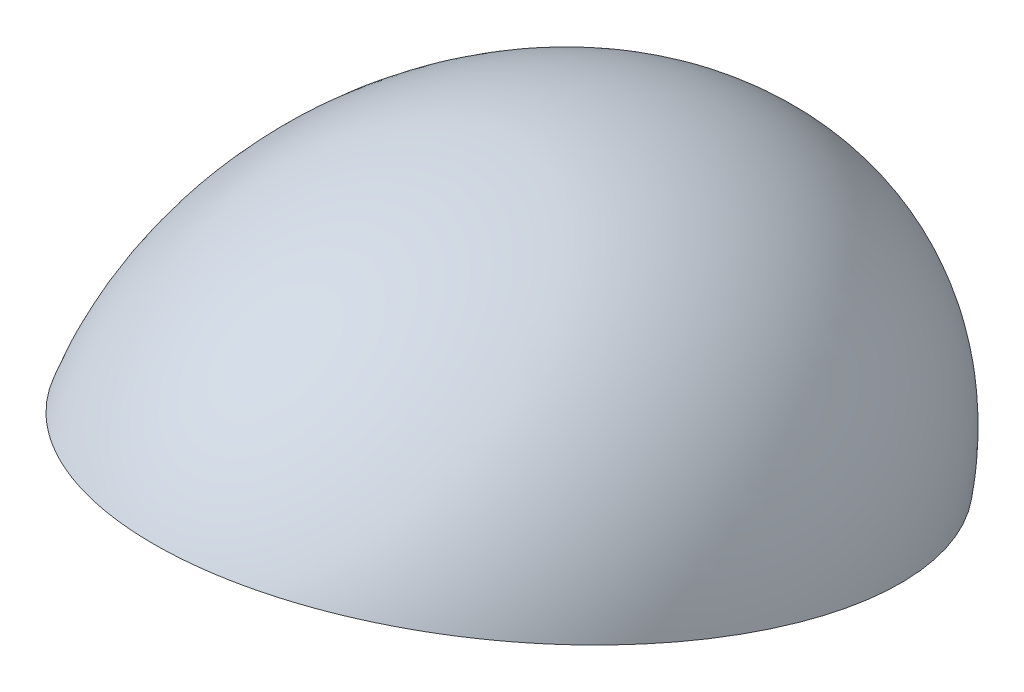
ISO-10303-21;
HEADER;
FILE_DESCRIPTION(('STEP AP214'),'2;1');
FILE_NAME('part.step','',(''),(''),'','','');
FILE_SCHEMA(('AUTOMOTIVE_DESIGN { 1 0 10303 214 1 1 1 1 }'));
ENDSEC;
DATA;
#1=APPLICATION_CONTEXT('core data for automotive mechanical design processes');
#2=APPLICATION_PROTOCOL_DEFINITION('international standard','automotive_design',2000,#1);
#3=PRODUCT_CONTEXT('',#1,'mechanical');
#4=PRODUCT('Part','Part','',(#3));
#5=PRODUCT_RELATED_PRODUCT_CATEGORY('part','',(#4));
#6=PRODUCT_DEFINITION_FORMATION('','',#4);
#7=PRODUCT_DEFINITION_CONTEXT('part definition',#1,'design');
#8=PRODUCT_DEFINITION('design','',#6,#7);
#9=PRODUCT_DEFINITION_SHAPE('','',#8);
#10=(LENGTH_UNIT() NAMED_UNIT(*) SI_UNIT(.MILLI.,.METRE.));
#11=(NAMED_UNIT(*) PLANE_ANGLE_UNIT() SI_UNIT($,.RADIAN.));
#12=(NAMED_UNIT(*) SI_UNIT($,.STERADIAN.) SOLID_ANGLE_UNIT());
#13=UNCERTAINTY_MEASURE_WITH_UNIT(LENGTH_MEASURE(1.E-05),#10,'distance_accuracy_value','');
#14=(GEOMETRIC_REPRESENTATION_CONTEXT(3) GLOBAL_UNCERTAINTY_ASSIGNED_CONTEXT((#13)) GLOBAL_UNIT_ASSIGNED_CONTEXT((#10,
#11,#12)) REPRESENTATION_CONTEXT('',''));
#15=CARTESIAN_POINT('',(0.,0.,0.));
#16=DIRECTION('',(0.,0.,1.));
#17=DIRECTION('',(1.,0.,0.));
#18=AXIS2_PLACEMENT_3D('',#15,#16,#17);
#19=CARTESIAN_POINT('',(0.,0.,0.));
#20=DIRECTION('',(0.,1.,0.));
#21=DIRECTION('',(0.,0.,1.));
#22=AXIS2_PLACEMENT_3D('',#19,#20,#21);
#23=ELLIPSE('',#22,240.,190.);
#24=TRIMMED_CURVE('',#23,(PARAMETER_VALUE(3.14159265358979)),
(PARAMETER_VALUE(6.28318530717959)),.T.,.PARAMETER.);
#25=CARTESIAN_POINT('',(0.,0.,-240.));
#26=DIRECTION('',(0.,0.,-1.));
#27=AXIS1_PLACEMENT('',#25,#26);
#28=SURFACE_OF_REVOLUTION('',#24,#27);
#29=CARTESIAN_POINT('',(0.,0.,-240.));
#30=VERTEX_POINT('',#29);
#31=VERTEX_LOOP('',#30);
#32=FACE_BOUND('',#31,.T.);
#33=CARTESIAN_POINT('',(-179.88213470112,0.,-77.2740661031294));
#34=CARTESIAN_POINT('',(-181.597068161881,1.70676053249948,-70.9043490794877));
#35=CARTESIAN_POINT('',(-183.068106610468,3.43042287389849,-64.471553646293));
#36=CARTESIAN_POINT('',(-184.91080085744,6.03285946592704,-54.7591280613656));
#37=CARTESIAN_POINT('',(-185.46447876189,6.90337601366443,-51.51031607638));
#38=CARTESIAN_POINT('',(-186.450947714877,8.6489877076251,-44.9956045442321));
#39=CARTESIAN_POINT('',(-186.883741548787,9.52408274787881,-41.7297053925535));
#40=CARTESIAN_POINT('',(-188.002755594436,12.1581478227158,-31.8992407028188));
#41=CARTESIAN_POINT('',(-188.507209374267,13.9224988308725,-25.314593097992));
#42=CARTESIAN_POINT('',(-189.033194761654,17.4559064233394,-12.1277364390553));
#43=CARTESIAN_POINT('',(-189.054728440315,19.2249629874362,-5.5255274603824));
#44=CARTESIAN_POINT('',(-188.662537054278,22.377500116953,6.23990127972219));
#45=CARTESIAN_POINT('',(-188.341744999502,23.7617974541025,11.4061692747466));
#46=CARTESIAN_POINT('',(-187.402639666538,26.5238640793082,21.7143422539053));
#47=CARTESIAN_POINT('',(-186.784283695396,27.901632401961,26.8562436351049));
#48=CARTESIAN_POINT('',(-185.248833669656,30.6461525004436,37.0989320850364));
#49=CARTESIAN_POINT('',(-184.331703448527,32.0129029220245,42.1997140996427));
#50=CARTESIAN_POINT('',(-182.197657800818,34.7299825034076,52.3399931455731));
#51=CARTESIAN_POINT('',(-180.980885673647,36.0803191898621,57.3795182667456));
#52=CARTESIAN_POINT('',(-178.245504537261,38.7602508631718,67.381159432351));
#53=CARTESIAN_POINT('',(-176.726927064428,40.0898480015114,72.3432835062327));
#54=CARTESIAN_POINT('',(-173.38604314153,42.7229483064285,82.1701476256092));
#55=CARTESIAN_POINT('',(-171.563796647528,44.0264565671711,87.0349066827863));
#56=CARTESIAN_POINT('',(-167.182949180432,46.8824746374477,97.6937112283941));
#57=CARTESIAN_POINT('',(-164.550402291502,48.4274358086109,103.459584814897));
#58=CARTESIAN_POINT('',(-158.827229623419,51.4597079034422,114.776178335181));
#59=CARTESIAN_POINT('',(-155.736627260834,52.9470217692372,120.32690924913));
#60=CARTESIAN_POINT('',(-150.758427814153,55.1241385024952,128.452019511657));
#61=CARTESIAN_POINT('',(-149.04279749478,55.8405691085526,131.125774933561));
#62=CARTESIAN_POINT('',(-145.496661699938,57.2542288888508,136.401625058251));
#63=CARTESIAN_POINT('',(-143.666152753616,57.9514574820204,139.00371759245));
#64=CARTESIAN_POINT('',(-139.890822346278,59.3247528722945,144.128925762753));
#65=CARTESIAN_POINT('',(-137.9460136171,60.000822013539,146.652050147307));
#66=CARTESIAN_POINT('',(-133.942602137556,61.329899273578,151.612234008957));
#67=CARTESIAN_POINT('',(-131.884011789373,61.9829098930822,154.049302818829));
#68=CARTESIAN_POINT('',(-127.468670404852,63.31995266783,159.039214386081));
#69=CARTESIAN_POINT('',(-125.101587945964,64.0017042201319,161.583545817411));
#70=CARTESIAN_POINT('',(-120.235592708223,65.3328220405352,166.551345154017));
#71=CARTESIAN_POINT('',(-117.736693645207,65.9821916644296,168.974825583283));
#72=CARTESIAN_POINT('',(-112.609319812475,67.2457379469962,173.690444507536));
#73=CARTESIAN_POINT('',(-109.980846356625,67.8599149623801,175.98258433379));
#74=CARTESIAN_POINT('',(-104.597863162,69.0500359465907,180.424176314018));
#75=CARTESIAN_POINT('',(-101.843361968997,69.6259825013022,182.573638118646));
#76=CARTESIAN_POINT('',(-96.2125447998159,70.736601138244,186.718523299546));
#77=CARTESIAN_POINT('',(-93.3362241566787,71.2712716369504,188.713940766026));
#78=CARTESIAN_POINT('',(-87.4673467648146,72.2961803276195,192.538952072723));
#79=CARTESIAN_POINT('',(-84.4747875039907,72.7864175585462,194.368542326303));
#80=CARTESIAN_POINT('',(-79.1235446422545,73.6055529630554,197.42559727421));
#81=CARTESIAN_POINT('',(-76.7880943497243,73.9446561552907,198.691147616641));
#82=CARTESIAN_POINT('',(-72.0583353793429,74.5942937665922,201.115628188526));
#83=CARTESIAN_POINT('',(-69.6640236119256,74.9048266819654,202.274552806121));
#84=CARTESIAN_POINT('',(-64.8208953947413,75.4959723467351,204.480738461716));
#85=CARTESIAN_POINT('',(-62.3720796922238,75.7765855060267,205.528001029465));
#86=CARTESIAN_POINT('',(-57.4244014989031,76.306658917343,207.506261932239));
#87=CARTESIAN_POINT('',(-54.9255360105271,76.5561172969381,208.437253279261));
#88=CARTESIAN_POINT('',(-49.8853052536867,77.0224785671341,210.177737234315));
#89=CARTESIAN_POINT('',(-47.3439793939437,77.2394099639149,210.987336228858));
#90=CARTESIAN_POINT('',(-42.2222316254989,77.6399202529568,212.482060976517));
#91=CARTESIAN_POINT('',(-39.6418079208129,77.8234976080158,213.167180992716));
#92=CARTESIAN_POINT('',(-34.4483703025344,78.1563280651765,214.409321169146));
#93=CARTESIAN_POINT('',(-31.8353598382604,78.3055847681595,214.966354768049));
#94=CARTESIAN_POINT('',(-26.5834993305325,78.5689851056789,215.949378210402));
#95=CARTESIAN_POINT('',(-23.9446534540812,78.683134309493,216.37538883868));
#96=CARTESIAN_POINT('',(-18.2632340295829,78.8896991857254,217.146299451839));
#97=CARTESIAN_POINT('',(-15.2176188716629,78.9765609057486,217.470471804198));
#98=CARTESIAN_POINT('',(-9.11207014033027,79.1028199843052,217.941677100288));
#99=CARTESIAN_POINT('',(-6.05213799618496,79.1422219833714,218.088727362723));
#100=CARTESIAN_POINT('',(0.0712269588664643,79.1732888517304,218.204670493871));
#101=CARTESIAN_POINT('',(3.13465961214561,79.1649557919096,218.173571091237));
#102=CARTESIAN_POINT('',(9.25313776869386,79.1006273948537,217.933494245055));
#103=CARTESIAN_POINT('',(12.3081854590956,79.0446459705515,217.724568725279));
#104=CARTESIAN_POINT('',(18.3999360173986,78.8854498169445,217.130440591648));
#105=CARTESIAN_POINT('',(21.436638223593,78.7822333940957,216.745231657401));
#106=CARTESIAN_POINT('',(27.4808205235628,78.5293192944584,215.801343387604));
#107=CARTESIAN_POINT('',(30.488302259419,78.3796242453577,215.242673858719));
#108=CARTESIAN_POINT('',(36.2792261346966,78.0454787546718,213.995625910359));
#109=CARTESIAN_POINT('',(39.0650213220479,77.863750189498,213.317405671944));
#110=CARTESIAN_POINT('',(44.5941994753889,77.461418086108,211.815881820576));
#111=CARTESIAN_POINT('',(47.3375847532998,77.2408166751809,210.992586146775));
#112=CARTESIAN_POINT('',(52.7747508070616,76.7620140235331,209.205670324026));
#113=CARTESIAN_POINT('',(55.4685334994442,76.5038142389767,208.242055609558));
#114=CARTESIAN_POINT('',(60.8002321771754,75.9512084426584,206.179702701141));
#115=CARTESIAN_POINT('',(63.4381444695643,75.6568000462558,205.080955607592));
#116=CARTESIAN_POINT('',(68.6520845202088,75.0333196503422,202.754095092519));
#117=CARTESIAN_POINT('',(71.2281109150334,74.7042468879863,201.52597882402));
#118=CARTESIAN_POINT('',(76.3131668599876,74.0130386599695,198.946354598451));
#119=CARTESIAN_POINT('',(78.822194336734,73.6509021726304,197.594842828427));
#120=CARTESIAN_POINT('',(83.2789360654109,72.9700597569005,195.053904340975));
#121=CARTESIAN_POINT('',(85.2394532151808,72.6569455791491,193.885346321037));
#122=CARTESIAN_POINT('',(89.1125608039865,72.011378846327,191.476058474468));
#123=CARTESIAN_POINT('',(91.025148138255,71.6789250430955,190.235323989639));
#124=CARTESIAN_POINT('',(94.8003589448347,70.9955945875017,187.685100011003));
#125=CARTESIAN_POINT('',(96.6629850122226,70.6447188948157,186.375614098758));
#126=CARTESIAN_POINT('',(100.336998655853,69.9253703164341,183.690968655885));
#127=CARTESIAN_POINT('',(102.148382178063,69.5568960445995,182.315803952117));
#128=CARTESIAN_POINT('',(105.718887235297,68.8031422452033,179.502756476372));
#129=CARTESIAN_POINT('',(107.477996403903,68.4178587935101,178.064859059337));
#130=CARTESIAN_POINT('',(110.942450297081,67.6314061830268,175.129777959268));
#131=CARTESIAN_POINT('',(112.647791319717,67.2302359347024,173.632590210036));
#132=CARTESIAN_POINT('',(117.68155377774,66.0041734684973,169.056862792905));
#133=CARTESIAN_POINT('',(120.928212575807,65.1566240606447,165.893765340874));
#134=CARTESIAN_POINT('',(127.689679944177,63.2702139819356,158.853587083222));
#135=CARTESIAN_POINT('',(131.166399140597,62.2222248449827,154.942438378333));
#136=CARTESIAN_POINT('',(137.814441137187,60.0632627681039,146.885082215807));
#137=CARTESIAN_POINT('',(140.985737186933,58.9522843247864,142.738854219231));
#138=CARTESIAN_POINT('',(147.021956832124,56.6752855890074,134.240979248534));
#139=CARTESIAN_POINT('',(149.886743997867,55.5092411162892,129.889242032464));
#140=CARTESIAN_POINT('',(155.308272184889,53.1301976425776,121.010530915157));
#141=CARTESIAN_POINT('',(157.864998861396,51.917196458527,116.483548866639));
#142=CARTESIAN_POINT('',(163.139487353445,49.2110567027893,106.384097805843));
#143=CARTESIAN_POINT('',(165.791732053879,47.709346433883,100.779638784036));
#144=CARTESIAN_POINT('',(170.661400939239,44.6594210466903,89.3971622797386));
#145=CARTESIAN_POINT('',(172.878778322297,43.1112009435153,83.6191261933898));
#146=CARTESIAN_POINT('',(176.883203116492,39.9772562451029,71.9230853508028));
#147=CARTESIAN_POINT('',(178.670060910674,38.391515460794,66.0050201761277));
#148=CARTESIAN_POINT('',(181.815982756888,35.1917937247955,54.0634960872979));
#149=CARTESIAN_POINT('',(183.175027645437,33.5778115114744,48.0400324646711));
#150=CARTESIAN_POINT('',(185.21834397409,30.6839063742266,37.239831460177));
#151=CARTESIAN_POINT('',(185.985122021765,29.4078311034677,32.4774537154222));
#152=CARTESIAN_POINT('',(187.260152957009,26.8468954179971,22.9199116223295));
#153=CARTESIAN_POINT('',(187.768379133368,25.5620341094834,18.1247439382763));
#154=CARTESIAN_POINT('',(188.526959058134,22.9871985551183,8.51532682825073));
#155=CARTESIAN_POINT('',(188.777304481571,21.6972241455541,3.70107679129301));
#156=CARTESIAN_POINT('',(189.020615816578,19.1144879095742,-5.93782606393373));
#157=CARTESIAN_POINT('',(189.01334976543,17.8217246191492,-10.76248434596));
#158=CARTESIAN_POINT('',(188.740852248904,15.2380568013701,-20.4048639117925));
#159=CARTESIAN_POINT('',(188.475628973255,13.9471522163082,-25.2225854109675));
#160=CARTESIAN_POINT('',(187.686793044176,11.370582413314,-34.83847482499));
#161=CARTESIAN_POINT('',(187.163167675798,10.0849174563423,-39.6366417659196));
#162=CARTESIAN_POINT('',(185.802062523935,7.41528391673231,-49.5998497733345));
#163=CARTESIAN_POINT('',(184.942006436426,6.03208141186353,-54.7620317986616));
#164=CARTESIAN_POINT('',(182.915908060477,3.28063997883242,-65.0305510207844));
#165=CARTESIAN_POINT('',(181.749840727018,1.91240228499417,-70.1368836110199));
#166=CARTESIAN_POINT('',(179.109613399948,-0.804261061910605,-80.2756092487292));
#167=CARTESIAN_POINT('',(177.635409035052,-2.1526838316938,-85.3079915356431));
#168=CARTESIAN_POINT('',(174.378149920484,-4.82308998544305,-95.2740829782804));
#169=CARTESIAN_POINT('',(172.595360515407,-6.14509500484135,-100.207872878536));
#170=CARTESIAN_POINT('',(168.718030616569,-8.75796478690618,-109.959235658764));
#171=CARTESIAN_POINT('',(166.62352731162,-10.048833242979,-114.776822322716));
#172=CARTESIAN_POINT('',(162.120854733619,-12.5931056492015,-124.272176211034));
#173=CARTESIAN_POINT('',(159.712782531422,-13.8465210465863,-128.949986157064));
#174=CARTESIAN_POINT('',(155.715443912557,-15.7649497171697,-136.109659426378));
#175=CARTESIAN_POINT('',(154.234570076725,-16.4452223467479,-138.648471442963));
#176=CARTESIAN_POINT('',(151.174445035372,-17.7907609826175,-143.670089995575));
#177=CARTESIAN_POINT('',(149.595200764904,-18.4560280422981,-146.152900462905));
#178=CARTESIAN_POINT('',(146.338357326863,-19.7701858162646,-151.057404044511));
#179=CARTESIAN_POINT('',(144.660763467363,-20.4190774116596,-153.479100447129));
#180=CARTESIAN_POINT('',(141.20722770482,-21.6991146532039,-158.256264468153));
#181=CARTESIAN_POINT('',(139.431284445592,-22.3302600544619,-160.611731172611));
#182=CARTESIAN_POINT('',(135.783361083899,-23.5726252712198,-165.248301283109));
#183=CARTESIAN_POINT('',(133.911485754001,-24.1838656807524,-167.529481547123));
#184=CARTESIAN_POINT('',(130.070663300571,-25.3855114774752,-172.014084713195));
#185=CARTESIAN_POINT('',(128.101722720567,-25.9759182645456,-174.217512839675));
#186=CARTESIAN_POINT('',(124.067996933379,-27.1341556824582,-178.540113730553));
#187=CARTESIAN_POINT('',(122.003232824849,-27.7019912324502,-180.659304853467));
#188=CARTESIAN_POINT('',(117.778124878851,-28.8136469980435,-184.808060651188));
#189=CARTESIAN_POINT('',(115.617756399338,-29.3574609490487,-186.837601946204));
#190=CARTESIAN_POINT('',(111.579176285418,-30.3287924929453,-190.462660619021));
#191=CARTESIAN_POINT('',(109.715475572004,-30.7603577305244,-192.073284012447));
#192=CARTESIAN_POINT('',(105.925048689719,-31.6045229296116,-195.223751425422));
#193=CARTESIAN_POINT('',(103.998324451698,-32.0171234712108,-196.7635976099));
#194=CARTESIAN_POINT('',(100.083519749757,-32.8222365842939,-199.768320653767));
#195=CARTESIAN_POINT('',(98.0954459537521,-33.2147513266077,-201.233205614802));
#196=CARTESIAN_POINT('',(94.0597350303113,-33.9785958653765,-204.083912242571));
#197=CARTESIAN_POINT('',(92.0121043773424,-34.3499279517123,-205.469742455257));
#198=CARTESIAN_POINT('',(87.8590984297538,-35.0703500519068,-208.158394336078));
#199=CARTESIAN_POINT('',(85.7537210557358,-35.419439263315,-209.461213009428));
#200=CARTESIAN_POINT('',(81.4880547621425,-36.0941932244158,-211.979429074865));
#201=CARTESIAN_POINT('',(79.3277741470586,-36.4198614884832,-213.194839582777));
#202=CARTESIAN_POINT('',(74.9544881360523,-37.046769586285,-215.53449245545));
#203=CARTESIAN_POINT('',(72.7414751929796,-37.3480058957712,-216.658721667537));
#204=CARTESIAN_POINT('',(68.2663672639679,-37.9248934064812,-218.811695167759));
#205=CARTESIAN_POINT('',(66.0042755959151,-38.2005463306194,-219.840445885897));
#206=CARTESIAN_POINT('',(61.4187729154448,-38.7270419082896,-221.805354131723));
#207=CARTESIAN_POINT('',(59.0950477614044,-38.9777014440664,-222.740828254644));
#208=CARTESIAN_POINT('',(54.405280154863,-39.4510391338837,-224.507348562179));
#209=CARTESIAN_POINT('',(52.039235729795,-39.6737159797042,-225.338389864451));
#210=CARTESIAN_POINT('',(47.2694267248686,-40.0901271408067,-226.892457474524));
#211=CARTESIAN_POINT('',(44.8656625663472,-40.283861779125,-227.615484987914));
#212=CARTESIAN_POINT('',(40.0251617129029,-40.6415400221119,-228.950358363503));
#213=CARTESIAN_POINT('',(37.5884239632774,-40.8054826714138,-229.562200660225));
#214=CARTESIAN_POINT('',(32.6886856067755,-41.1027306001452,-230.671545032695));
#215=CARTESIAN_POINT('',(30.2257011320899,-41.236053677828,-231.169113532429));
#216=CARTESIAN_POINT('',(25.2774965786604,-41.4715595133252,-232.048033275984));
#217=CARTESIAN_POINT('',(22.7922756783084,-41.5737411155695,-232.429380207158));
#218=CARTESIAN_POINT('',(17.8056201530675,-41.7464566287261,-233.073963277514));
#219=CARTESIAN_POINT('',(15.3041866551789,-41.8169927160048,-233.337207539005));
#220=CARTESIAN_POINT('',(10.2912815831355,-41.9260740402821,-233.744304583365));
#221=CARTESIAN_POINT('',(7.7798113237146,-41.9646233376409,-233.888172519704));
#222=CARTESIAN_POINT('',(2.30786825003945,-42.0135233088805,-234.070669696859));
#223=CARTESIAN_POINT('',(-0.653461702319982,-42.0176813518892,-234.086187724627));
#224=CARTESIAN_POINT('',(-6.57173570577881,-41.9814048918556,-233.950802132663));
#225=CARTESIAN_POINT('',(-9.52868009699295,-41.9409740497514,-233.799912175738));
#226=CARTESIAN_POINT('',(-15.428407458295,-41.8158099831593,-233.332793519934));
#227=CARTESIAN_POINT('',(-18.3711910393068,-41.7310786874867,-233.016572019493));
#228=CARTESIAN_POINT('',(-24.2326043638066,-41.5179057576151,-232.220999814414));
#229=CARTESIAN_POINT('',(-27.1512372174454,-41.3894698443772,-231.741670460693));
#230=CARTESIAN_POINT('',(-32.9555214465554,-41.0897368650205,-230.62305175303));
#231=CARTESIAN_POINT('',(-35.8411717399049,-40.918438396825,-229.983757166466));
#232=CARTESIAN_POINT('',(-41.570557477954,-40.5340929276465,-228.549360347833));
#233=CARTESIAN_POINT('',(-44.4142938342082,-40.3210468360458,-227.754261509625));
#234=CARTESIAN_POINT('',(-49.9891246249001,-39.8597138103884,-226.032543218662));
#235=CARTESIAN_POINT('',(-52.7213179841683,-39.6123149364492,-225.109238051385));
#236=CARTESIAN_POINT('',(-58.1309056457664,-39.080279234189,-223.12365377911));
#237=CARTESIAN_POINT('',(-60.8083013334128,-38.7956433485891,-222.061378192393));
#238=CARTESIAN_POINT('',(-66.1020295151256,-38.190672007649,-219.803594410882));
#239=CARTESIAN_POINT('',(-68.7183638426039,-37.8703376258545,-218.608090222613));
#240=CARTESIAN_POINT('',(-73.8847722402976,-37.1955577032779,-216.08977726763));
#241=CARTESIAN_POINT('',(-76.4348399673734,-36.8411089121761,-214.766956370556));
#242=CARTESIAN_POINT('',(-81.463646765491,-36.0998151818238,-212.000410505549));
#243=CARTESIAN_POINT('',(-83.9423849500811,-35.7129698401968,-210.556684035926));
#244=CARTESIAN_POINT('',(-88.8244902520579,-34.9085878546625,-207.554689597218));
#245=CARTESIAN_POINT('',(-91.2278543702883,-34.4910499916956,-205.996417078542));
#246=CARTESIAN_POINT('',(-95.5392177283129,-33.7031290370976,-203.055856043634));
#247=CARTESIAN_POINT('',(-97.4599252485521,-33.3373887070621,-201.690894549565));
#248=CARTESIAN_POINT('',(-101.246210709481,-32.5871991380939,-198.891148962867));
#249=CARTESIAN_POINT('',(-103.111784971669,-32.2027486553253,-197.45636022818));
#250=CARTESIAN_POINT('',(-106.786173369505,-31.4161294366432,-194.520657337848));
#251=CARTESIAN_POINT('',(-108.594989232225,-31.0139612407499,-193.019745197586));
#252=CARTESIAN_POINT('',(-112.15488445454,-30.1927968079915,-189.955117813163));
#253=CARTESIAN_POINT('',(-113.905959324912,-29.7737992682767,-188.391397706701));
#254=CARTESIAN_POINT('',(-117.350172021393,-28.9196873912935,-185.203808786451));
#255=CARTESIAN_POINT('',(-119.043279064623,-28.4845647388045,-183.579908939838));
#256=CARTESIAN_POINT('',(-122.369851511333,-27.5992877296729,-180.276010162986));
#257=CARTESIAN_POINT('',(-124.003312933409,-27.1491323734081,-178.596007502107));
#258=CARTESIAN_POINT('',(-128.813029870172,-25.7774649429868,-173.476874960687));
#259=CARTESIAN_POINT('',(-131.899137740521,-24.8346222163063,-169.958138001168));
#260=CARTESIAN_POINT('',(-138.339838035482,-22.7312086454674,-162.108091685467));
#261=CARTESIAN_POINT('',(-141.648381846832,-21.561207151784,-157.741586666109));
#262=CARTESIAN_POINT('',(-147.926823799434,-19.1617343310401,-148.786632187712));
#263=CARTESIAN_POINT('',(-150.896667682894,-17.9322535205351,-144.198147335976));
#264=CARTESIAN_POINT('',(-156.495866418748,-15.4233120384613,-134.834650251659));
#265=CARTESIAN_POINT('',(-159.125388079808,-14.143876255652,-130.059730905192));
#266=CARTESIAN_POINT('',(-164.046557758766,-11.542662305715,-120.35186828267));
#267=CARTESIAN_POINT('',(-166.338274913233,-10.2208928703778,-115.4189575941));
#268=CARTESIAN_POINT('',(-170.753506198272,-7.4367090215796,-105.028242012772));
#269=CARTESIAN_POINT('',(-172.849766049425,-5.97138997750012,-99.5595968909686));
#270=CARTESIAN_POINT('',(-175.703726539099,-3.7491242368628,-91.2659882389899));
#271=CARTESIAN_POINT('',(-176.606525706173,-3.00443711224502,-88.4867780541739));
#272=CARTESIAN_POINT('',(-178.316200060612,-1.50760460311132,-82.9005230796658));
#273=CARTESIAN_POINT('',(-179.123059153751,-0.755457990107786,-80.0934737051956));
#274=CARTESIAN_POINT('',(-179.88213470112,0.,-77.2740661031294));
#275=B_SPLINE_CURVE_WITH_KNOTS('',3,(#33,#34,#35,#36,#37,#38,#39,#40,#41,#42,#43,#44,#45,#46,
#47,#48,#49,#50,#51,#52,#53,#54,#55,#56,#57,#58,#59,#60,#61,#62,#63,#64,#65,#66,#67,#68,#69,#70,
#71,#72,#73,#74,#75,#76,#77,#78,#79,#80,#81,#82,#83,#84,#85,#86,#87,#88,#89,#90,#91,#92,#93,#94,
#95,#96,#97,#98,#99,#100,#101,#102,#103,#104,#105,#106,#107,#108,#109,#110,#111,#112,#113,#114,
#115,#116,#117,#118,#119,#120,#121,#122,#123,#124,#125,#126,#127,#128,#129,#130,#131,#132,#133,
#134,#135,#136,#137,#138,#139,#140,#141,#142,#143,#144,#145,#146,#147,#148,#149,#150,#151,#152,
#153,#154,#155,#156,#157,#158,#159,#160,#161,#162,#163,#164,#165,#166,#167,#168,#169,#170,#171,
#172,#173,#174,#175,#176,#177,#178,#179,#180,#181,#182,#183,#184,#185,#186,#187,#188,#189,#190,
#191,#192,#193,#194,#195,#196,#197,#198,#199,#200,#201,#202,#203,#204,#205,#206,#207,#208,#209,
#210,#211,#212,#213,#214,#215,#216,#217,#218,#219,#220,#221,#222,#223,#224,#225,#226,#227,#228,
#229,#230,#231,#232,#233,#234,#235,#236,#237,#238,#239,#240,#241,#242,#243,#244,#245,#246,#247,
#248,#249,#250,#251,#252,#253,#254,#255,#256,#257,#258,#259,#260,#261,#262,#263,#264,#265,#266,
#267,#268,#269,#270,#271,#272,#273,#274),.UNSPECIFIED.,.T.,.F.,(4,2,2,2,2,2,2,2,2,2,2,2,2,2,2,2,
2,2,2,2,2,2,2,2,2,2,2,2,2,2,2,2,2,2,2,2,2,2,2,2,2,2,2,2,2,2,2,2,2,2,2,2,2,2,2,2,2,2,2,2,2,2,2,2,
2,2,2,2,2,2,2,2,2,2,2,2,2,2,2,2,2,2,2,2,2,2,2,2,2,2,2,2,2,2,2,2,2,2,2,2,2,2,2,2,2,2,2,2,2,2,2,2,
2,2,2,2,2,2,2,2,4),(0.,20.4387814416535,30.6631480219885,40.8872789962815,61.3754975078148,
81.8636281513395,97.9300840547009,113.998845778844,130.069553344814,146.132590201934,
162.193949474499,178.252141359796,197.805129111711,217.3571176265,227.12463651897,
236.892450661801,246.659178823699,256.424844504767,267.044463166255,277.66297900215,
288.281387189842,298.89907642149,309.517172790336,320.135498760553,328.166375104902,
336.197673883835,344.228862621319,352.26053380824,360.285124487787,368.310084906287,
376.334202971039,384.357047472592,393.543585267268,402.729224744574,411.914465725004,
421.097025609876,430.279914748218,439.462284822726,448.076792777272,456.690829455236,
465.304532604978,473.918803343385,482.533263692244,491.147990320442,498.057535228122,
504.967526567007,511.877158290896,518.787335147228,525.699133919749,532.611407534838,
546.434028699503,562.429779046299,578.426929105974,594.431170266899,610.436156374203,
629.556354814769,648.678609906892,667.809271823449,686.940790558404,701.903207670739,
716.867170249181,731.831615882843,746.809536388122,761.786981383901,776.765163434276,
792.99536740531,809.226900126981,825.460771778028,841.680753050087,857.898800757476,
874.111839761319,883.160521451819,892.208565936459,901.256122533564,910.30380392258,
919.341806117,928.379199857163,937.414613076574,946.452368896397,953.952848815672,
961.453099157825,968.952537169625,976.451162937189,983.95005907774,991.44782763124,
998.946675802585,1006.44501859662,1013.99478617051,1021.54490657268,1029.09494269843,
1036.6452208953,1044.19109916739,1051.73725741112,1059.2828966011,1066.8275778112,
1075.70654301234,1084.58477926674,1093.46262900023,1102.33931706453,1111.21629553206,
1120.09308065517,1128.77265901608,1137.45201768055,1146.13111540476,1154.8110408678,
1163.49107415453,1172.17145238523,1179.32335830184,1186.47574032264,1193.62790449576,
1200.78062342746,1207.93708357037,1215.09402054414,1229.40573663867,1246.19574728684,
1262.98844383186,1279.77287802415,1296.55387225575,1314.64989149124,1323.695129132,
1332.74188200338),.UNSPECIFIED.);
#276=CARTESIAN_POINT('',(-179.88213470112,0.,-77.2740661031294));
#277=VERTEX_POINT('',#276);
#278=EDGE_CURVE('E11',#277,#277,#275,.T.);
#279=ORIENTED_EDGE('',*,*,#278,.T.);
#280=EDGE_LOOP('',(#279));
#281=FACE_BOUND('',#280,.T.);
#282=ADVANCED_FACE('F32',(#32,#281),#28,.F.);
#283=CARTESIAN_POINT('',(0.,19.3185165257814,-5.17638090205016));
#284=DIRECTION('',(0.,-0.965925826289072,0.258819045102508));
#285=DIRECTION('',(0.,-0.258819045102508,-0.965925826289072));
#286=AXIS2_PLACEMENT_3D('',#283,#284,#285);
#287=PLANE('',#286);
#288=ORIENTED_EDGE('',*,*,#278,.F.);
#289=EDGE_LOOP('',(#288));
#290=FACE_BOUND('',#289,.T.);
#291=ADVANCED_FACE('F45',(#290),#287,.T.);
#292=CLOSED_SHELL('',(#282,#291));
#293=MANIFOLD_SOLID_BREP('B2',#292);
#294=ADVANCED_BREP_SHAPE_REPRESENTATION('',(#18,#293),#14);
#295=SHAPE_DEFINITION_REPRESENTATION(#9,#294);
ENDSEC;
END-ISO-10303-21;
